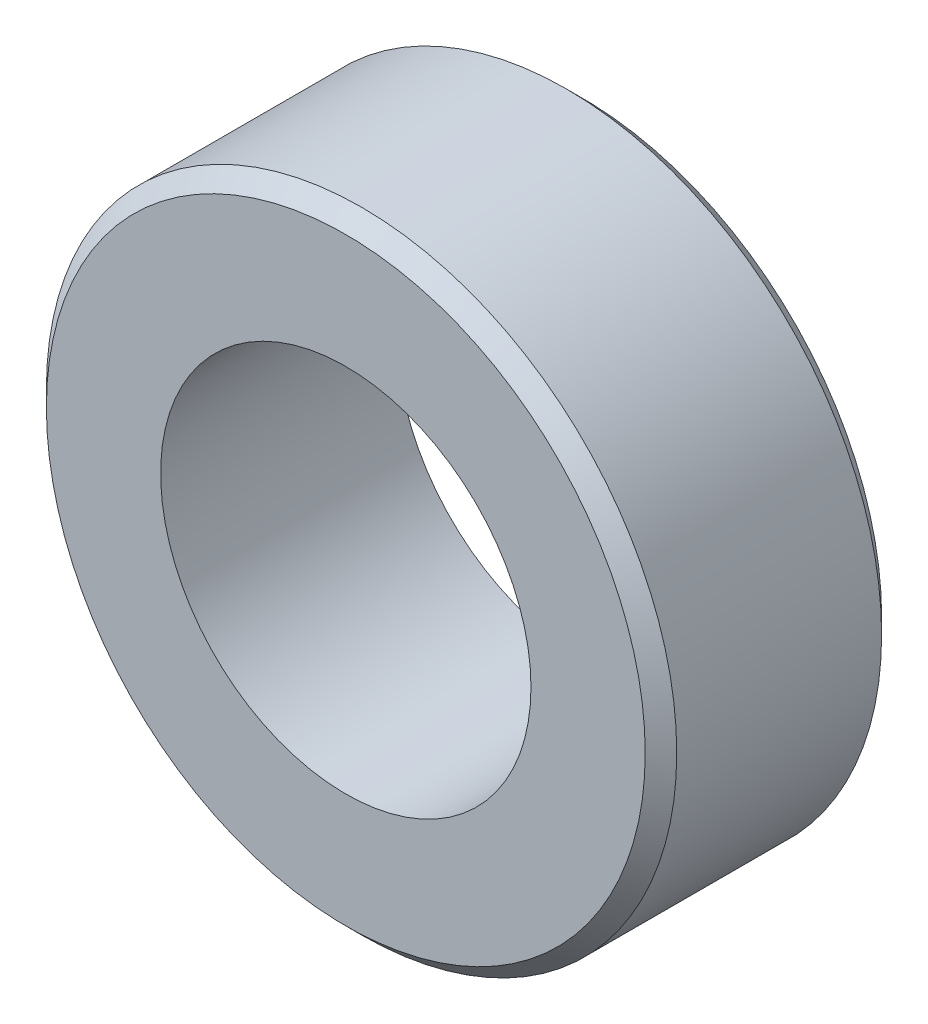
ISO-10303-21;
HEADER;
FILE_DESCRIPTION(('STEP AP214'),'2;1');
FILE_NAME('part.step','',(''),(''),'','','');
FILE_SCHEMA(('AUTOMOTIVE_DESIGN { 1 0 10303 214 1 1 1 1 }'));
ENDSEC;
DATA;
#1=APPLICATION_CONTEXT('core data for automotive mechanical design processes');
#2=APPLICATION_PROTOCOL_DEFINITION('international standard','automotive_design',2000,#1);
#3=PRODUCT_CONTEXT('',#1,'mechanical');
#4=PRODUCT('Part','Part','',(#3));
#5=PRODUCT_RELATED_PRODUCT_CATEGORY('part','',(#4));
#6=PRODUCT_DEFINITION_FORMATION('','',#4);
#7=PRODUCT_DEFINITION_CONTEXT('part definition',#1,'design');
#8=PRODUCT_DEFINITION('design','',#6,#7);
#9=PRODUCT_DEFINITION_SHAPE('','',#8);
#10=(LENGTH_UNIT() NAMED_UNIT(*) SI_UNIT(.MILLI.,.METRE.));
#11=(NAMED_UNIT(*) PLANE_ANGLE_UNIT() SI_UNIT($,.RADIAN.));
#12=(NAMED_UNIT(*) SI_UNIT($,.STERADIAN.) SOLID_ANGLE_UNIT());
#13=UNCERTAINTY_MEASURE_WITH_UNIT(LENGTH_MEASURE(1.E-05),#10,'distance_accuracy_value','');
#14=(GEOMETRIC_REPRESENTATION_CONTEXT(3) GLOBAL_UNCERTAINTY_ASSIGNED_CONTEXT((#13)) GLOBAL_UNIT_ASSIGNED_CONTEXT((#10,
#11,#12)) REPRESENTATION_CONTEXT('',''));
#15=CARTESIAN_POINT('',(0.,0.,0.));
#16=DIRECTION('',(0.,0.,1.));
#17=DIRECTION('',(1.,0.,0.));
#18=AXIS2_PLACEMENT_3D('',#15,#16,#17);
#19=CARTESIAN_POINT('',(0.,0.,30.));
#20=DIRECTION('',(0.,0.,1.));
#21=DIRECTION('',(1.,0.,0.));
#22=AXIS2_PLACEMENT_3D('',#19,#20,#21);
#23=PLANE('',#22);
#24=CARTESIAN_POINT('',(0.,0.,30.));
#25=DIRECTION('',(0.,0.,1.));
#26=DIRECTION('',(1.,0.,0.));
#27=AXIS2_PLACEMENT_3D('',#24,#25,#26);
#28=CIRCLE('',#27,38.);
#29=CARTESIAN_POINT('',(38.,0.,30.));
#30=VERTEX_POINT('',#29);
#31=EDGE_CURVE('E10',#30,#30,#28,.T.);
#32=ORIENTED_EDGE('',*,*,#31,.T.);
#33=EDGE_LOOP('',(#32));
#34=FACE_BOUND('',#33,.T.);
#35=CARTESIAN_POINT('',(0.,0.,30.));
#36=DIRECTION('',(0.,0.,1.));
#37=DIRECTION('',(1.,0.,0.));
#38=AXIS2_PLACEMENT_3D('',#35,#36,#37);
#39=CIRCLE('',#38,23.5);
#40=CARTESIAN_POINT('',(23.5,0.,30.));
#41=VERTEX_POINT('',#40);
#42=EDGE_CURVE('E51',#41,#41,#39,.T.);
#43=ORIENTED_EDGE('',*,*,#42,.F.);
#44=EDGE_LOOP('',(#43));
#45=FACE_BOUND('',#44,.T.);
#46=ADVANCED_FACE('F31',(#34,#45),#23,.T.);
#47=CARTESIAN_POINT('',(0.,0.,0.));
#48=DIRECTION('',(0.,0.,1.));
#49=DIRECTION('',(1.,0.,0.));
#50=AXIS2_PLACEMENT_3D('',#47,#48,#49);
#51=PLANE('',#50);
#52=CARTESIAN_POINT('',(0.,0.,0.));
#53=DIRECTION('',(0.,0.,1.));
#54=DIRECTION('',(1.,0.,0.));
#55=AXIS2_PLACEMENT_3D('',#52,#53,#54);
#56=CIRCLE('',#55,38.);
#57=CARTESIAN_POINT('',(38.,0.,0.));
#58=VERTEX_POINT('',#57);
#59=EDGE_CURVE('E38',#58,#58,#56,.F.);
#60=ORIENTED_EDGE('',*,*,#59,.T.);
#61=EDGE_LOOP('',(#60));
#62=FACE_BOUND('',#61,.T.);
#63=CARTESIAN_POINT('',(0.,0.,0.));
#64=DIRECTION('',(0.,0.,1.));
#65=DIRECTION('',(1.,0.,0.));
#66=AXIS2_PLACEMENT_3D('',#63,#64,#65);
#67=CIRCLE('',#66,23.5);
#68=CARTESIAN_POINT('',(23.5,0.,0.));
#69=VERTEX_POINT('',#68);
#70=EDGE_CURVE('E52',#69,#69,#67,.T.);
#71=ORIENTED_EDGE('',*,*,#70,.T.);
#72=EDGE_LOOP('',(#71));
#73=FACE_BOUND('',#72,.T.);
#74=ADVANCED_FACE('F62',(#62,#73),#51,.F.);
#75=CARTESIAN_POINT('',(0.,0.,30.));
#76=DIRECTION('',(0.,0.,-1.));
#77=DIRECTION('',(-1.,0.,0.));
#78=AXIS2_PLACEMENT_3D('',#75,#76,#77);
#79=CYLINDRICAL_SURFACE('',#78,40.);
#80=CARTESIAN_POINT('',(0.,0.,2.00000000000003));
#81=DIRECTION('',(0.,0.,1.));
#82=DIRECTION('',(1.,0.,0.));
#83=AXIS2_PLACEMENT_3D('',#80,#81,#82);
#84=CIRCLE('',#83,40.);
#85=CARTESIAN_POINT('',(40.,0.,2.00000000000003));
#86=VERTEX_POINT('',#85);
#87=EDGE_CURVE('E42',#86,#86,#84,.T.);
#88=ORIENTED_EDGE('',*,*,#87,.T.);
#89=EDGE_LOOP('',(#88));
#90=FACE_BOUND('',#89,.T.);
#91=CARTESIAN_POINT('',(0.,0.,28.));
#92=DIRECTION('',(0.,0.,1.));
#93=DIRECTION('',(1.,0.,0.));
#94=AXIS2_PLACEMENT_3D('',#91,#92,#93);
#95=CIRCLE('',#94,40.);
#96=CARTESIAN_POINT('',(40.,0.,28.));
#97=VERTEX_POINT('',#96);
#98=EDGE_CURVE('E46',#97,#97,#95,.F.);
#99=ORIENTED_EDGE('',*,*,#98,.T.);
#100=EDGE_LOOP('',(#99));
#101=FACE_BOUND('',#100,.T.);
#102=ADVANCED_FACE('F68',(#90,#101),#79,.T.);
#103=CARTESIAN_POINT('',(0.,0.,30.));
#104=DIRECTION('',(0.,0.,-1.));
#105=DIRECTION('',(-1.,0.,0.));
#106=AXIS2_PLACEMENT_3D('',#103,#104,#105);
#107=CYLINDRICAL_SURFACE('',#106,23.5);
#108=ORIENTED_EDGE('',*,*,#42,.T.);
#109=EDGE_LOOP('',(#108));
#110=FACE_BOUND('',#109,.T.);
#111=ORIENTED_EDGE('',*,*,#70,.F.);
#112=EDGE_LOOP('',(#111));
#113=FACE_BOUND('',#112,.T.);
#114=ADVANCED_FACE('F58',(#110,#113),#107,.F.);
#115=CARTESIAN_POINT('',(0.,0.,2.00000000000003));
#116=DIRECTION('',(0.,0.,1.));
#117=DIRECTION('',(1.,0.,0.));
#118=AXIS2_PLACEMENT_3D('',#115,#116,#117);
#119=CONICAL_SURFACE('',#118,40.,0.785398163397452);
#120=ORIENTED_EDGE('',*,*,#59,.F.);
#121=EDGE_LOOP('',(#120));
#122=FACE_BOUND('',#121,.T.);
#123=ORIENTED_EDGE('',*,*,#87,.F.);
#124=EDGE_LOOP('',(#123));
#125=FACE_BOUND('',#124,.T.);
#126=ADVANCED_FACE('F74',(#122,#125),#119,.T.);
#127=CARTESIAN_POINT('',(0.,0.,30.));
#128=DIRECTION('',(0.,0.,-1.));
#129=DIRECTION('',(-1.,0.,0.));
#130=AXIS2_PLACEMENT_3D('',#127,#128,#129);
#131=CONICAL_SURFACE('',#130,38.,0.785398163397445);
#132=ORIENTED_EDGE('',*,*,#98,.F.);
#133=EDGE_LOOP('',(#132));
#134=FACE_BOUND('',#133,.T.);
#135=ORIENTED_EDGE('',*,*,#31,.F.);
#136=EDGE_LOOP('',(#135));
#137=FACE_BOUND('',#136,.T.);
#138=ADVANCED_FACE('F33',(#134,#137),#131,.T.);
#139=CLOSED_SHELL('',(#46,#74,#102,#114,#126,#138));
#140=MANIFOLD_SOLID_BREP('B2',#139);
#141=ADVANCED_BREP_SHAPE_REPRESENTATION('',(#18,#140),#14);
#142=SHAPE_DEFINITION_REPRESENTATION(#9,#141);
ENDSEC;
END-ISO-10303-21;
